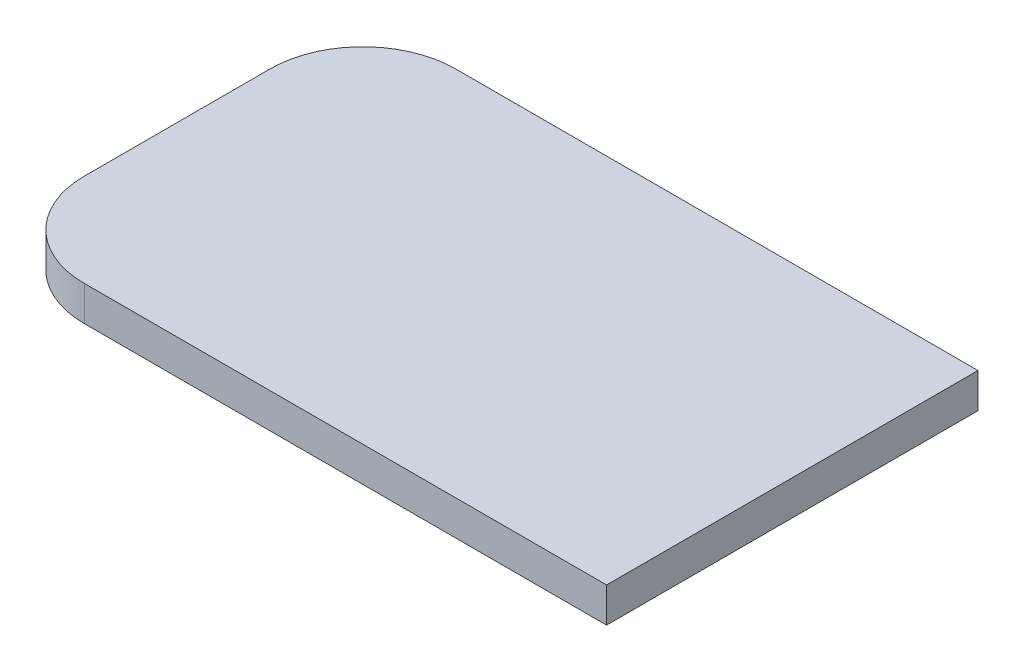
ISO-10303-21;
HEADER;
FILE_DESCRIPTION(('STEP AP214'),'2;1');
FILE_NAME('part.step','',(''),(''),'','','');
FILE_SCHEMA(('AUTOMOTIVE_DESIGN { 1 0 10303 214 1 1 1 1 }'));
ENDSEC;
DATA;
#1=APPLICATION_CONTEXT('core data for automotive mechanical design processes');
#2=APPLICATION_PROTOCOL_DEFINITION('international standard','automotive_design',2000,#1);
#3=PRODUCT_CONTEXT('',#1,'mechanical');
#4=PRODUCT('Part','Part','',(#3));
#5=PRODUCT_RELATED_PRODUCT_CATEGORY('part','',(#4));
#6=PRODUCT_DEFINITION_FORMATION('','',#4);
#7=PRODUCT_DEFINITION_CONTEXT('part definition',#1,'design');
#8=PRODUCT_DEFINITION('design','',#6,#7);
#9=PRODUCT_DEFINITION_SHAPE('','',#8);
#10=(LENGTH_UNIT() NAMED_UNIT(*) SI_UNIT(.MILLI.,.METRE.));
#11=(NAMED_UNIT(*) PLANE_ANGLE_UNIT() SI_UNIT($,.RADIAN.));
#12=(NAMED_UNIT(*) SI_UNIT($,.STERADIAN.) SOLID_ANGLE_UNIT());
#13=UNCERTAINTY_MEASURE_WITH_UNIT(LENGTH_MEASURE(1.E-05),#10,'distance_accuracy_value','');
#14=(GEOMETRIC_REPRESENTATION_CONTEXT(3) GLOBAL_UNCERTAINTY_ASSIGNED_CONTEXT((#13)) GLOBAL_UNIT_ASSIGNED_CONTEXT((#10,
#11,#12)) REPRESENTATION_CONTEXT('',''));
#15=CARTESIAN_POINT('',(0.,0.,0.));
#16=DIRECTION('',(0.,0.,1.));
#17=DIRECTION('',(1.,0.,0.));
#18=AXIS2_PLACEMENT_3D('',#15,#16,#17);
#19=CARTESIAN_POINT('',(-5.,8.,-8.));
#20=DIRECTION('',(0.,0.,1.));
#21=DIRECTION('',(1.,0.,0.));
#22=AXIS2_PLACEMENT_3D('',#19,#20,#21);
#23=PLANE('',#22);
#24=DIRECTION('',(1.,0.,0.));
#25=VECTOR('',#24,1.);
#26=CARTESIAN_POINT('',(-68.5,-5.,-8.));
#27=LINE('',#26,#25);
#28=CARTESIAN_POINT('',(-91.,-5.,-7.99999999999998));
#29=VERTEX_POINT('',#28);
#30=CARTESIAN_POINT('',(-68.5,-5.,-8.));
#31=VERTEX_POINT('',#30);
#32=EDGE_CURVE('E84',#29,#31,#27,.T.);
#33=ORIENTED_EDGE('',*,*,#32,.T.);
#34=DIRECTION('',(0.,1.,0.));
#35=VECTOR('',#34,1.);
#36=CARTESIAN_POINT('',(-68.5,-6.5,-8.));
#37=LINE('',#36,#35);
#38=CARTESIAN_POINT('',(-68.5,-6.5,-8.));
#39=VERTEX_POINT('',#38);
#40=EDGE_CURVE('E88',#39,#31,#37,.T.);
#41=ORIENTED_EDGE('',*,*,#40,.F.);
#42=DIRECTION('',(1.,0.,0.));
#43=VECTOR('',#42,1.);
#44=CARTESIAN_POINT('',(-68.5,-6.5,-8.));
#45=LINE('',#44,#43);
#46=CARTESIAN_POINT('',(-91.,-6.5,-7.99999999999998));
#47=VERTEX_POINT('',#46);
#48=EDGE_CURVE('E134',#47,#39,#45,.T.);
#49=ORIENTED_EDGE('',*,*,#48,.F.);
#50=DIRECTION('',(0.,-1.,0.));
#51=VECTOR('',#50,1.);
#52=CARTESIAN_POINT('',(-91.,5.5,-7.99999999999998));
#53=LINE('',#52,#51);
#54=EDGE_CURVE('E11',#29,#47,#53,.T.);
#55=ORIENTED_EDGE('',*,*,#54,.F.);
#56=EDGE_LOOP('',(#33,#41,#49,#55));
#57=FACE_BOUND('',#56,.T.);
#58=ADVANCED_FACE('F36',(#57),#23,.F.);
#59=CARTESIAN_POINT('',(-5.,8.,8.));
#60=DIRECTION('',(0.,0.,-1.));
#61=DIRECTION('',(-1.,0.,0.));
#62=AXIS2_PLACEMENT_3D('',#59,#60,#61);
#63=PLANE('',#62);
#64=DIRECTION('',(-1.,0.,0.));
#65=VECTOR('',#64,1.);
#66=CARTESIAN_POINT('',(-91.,-5.,8.));
#67=LINE('',#66,#65);
#68=CARTESIAN_POINT('',(-68.5,-5.,8.));
#69=VERTEX_POINT('',#68);
#70=CARTESIAN_POINT('',(-91.,-5.,8.));
#71=VERTEX_POINT('',#70);
#72=EDGE_CURVE('E92',#69,#71,#67,.T.);
#73=ORIENTED_EDGE('',*,*,#72,.T.);
#74=DIRECTION('',(0.,-1.,0.));
#75=VECTOR('',#74,1.);
#76=CARTESIAN_POINT('',(-91.,5.5,8.00000000000001));
#77=LINE('',#76,#75);
#78=CARTESIAN_POINT('',(-91.,-6.5,8.));
#79=VERTEX_POINT('',#78);
#80=EDGE_CURVE('E52',#71,#79,#77,.T.);
#81=ORIENTED_EDGE('',*,*,#80,.T.);
#82=DIRECTION('',(-1.,0.,0.));
#83=VECTOR('',#82,1.);
#84=CARTESIAN_POINT('',(-91.,-6.5,8.));
#85=LINE('',#84,#83);
#86=CARTESIAN_POINT('',(-68.5,-6.5,8.));
#87=VERTEX_POINT('',#86);
#88=EDGE_CURVE('E108',#87,#79,#85,.T.);
#89=ORIENTED_EDGE('',*,*,#88,.F.);
#90=DIRECTION('',(0.,1.,0.));
#91=VECTOR('',#90,1.);
#92=CARTESIAN_POINT('',(-68.5,-6.5,8.));
#93=LINE('',#92,#91);
#94=EDGE_CURVE('E106',#87,#69,#93,.T.);
#95=ORIENTED_EDGE('',*,*,#94,.T.);
#96=EDGE_LOOP('',(#73,#81,#89,#95));
#97=FACE_BOUND('',#96,.T.);
#98=ADVANCED_FACE('F38',(#97),#63,.F.);
#99=CARTESIAN_POINT('',(-91.,5.5,-3.99999999999998));
#100=DIRECTION('',(0.,-1.,0.));
#101=DIRECTION('',(0.,0.,-1.));
#102=AXIS2_PLACEMENT_3D('',#99,#100,#101);
#103=CYLINDRICAL_SURFACE('',#102,4.);
#104=CARTESIAN_POINT('',(-91.,-5.,-3.99999999999998));
#105=DIRECTION('',(0.,1.,0.));
#106=DIRECTION('',(0.,0.,1.));
#107=AXIS2_PLACEMENT_3D('',#104,#105,#106);
#108=CIRCLE('',#107,4.);
#109=CARTESIAN_POINT('',(-95.,-5.,-3.99999999999998));
#110=VERTEX_POINT('',#109);
#111=EDGE_CURVE('E93',#29,#110,#108,.T.);
#112=ORIENTED_EDGE('',*,*,#111,.F.);
#113=ORIENTED_EDGE('',*,*,#54,.T.);
#114=CARTESIAN_POINT('',(-91.,-6.5,-3.99999999999998));
#115=DIRECTION('',(0.,-1.,0.));
#116=DIRECTION('',(0.,0.,-1.));
#117=AXIS2_PLACEMENT_3D('',#114,#115,#116);
#118=CIRCLE('',#117,4.);
#119=CARTESIAN_POINT('',(-95.,-6.5,-3.99999999999998));
#120=VERTEX_POINT('',#119);
#121=EDGE_CURVE('E129',#120,#47,#118,.T.);
#122=ORIENTED_EDGE('',*,*,#121,.F.);
#123=DIRECTION('',(0.,-1.,0.));
#124=VECTOR('',#123,1.);
#125=CARTESIAN_POINT('',(-95.,5.5,-3.99999999999998));
#126=LINE('',#125,#124);
#127=EDGE_CURVE('E45',#110,#120,#126,.T.);
#128=ORIENTED_EDGE('',*,*,#127,.F.);
#129=EDGE_LOOP('',(#112,#113,#122,#128));
#130=FACE_BOUND('',#129,.T.);
#131=ADVANCED_FACE('F133',(#130),#103,.T.);
#132=CARTESIAN_POINT('',(-95.,5.5,-3.99999999999998));
#133=DIRECTION('',(1.,0.,0.));
#134=DIRECTION('',(0.,0.,-1.));
#135=AXIS2_PLACEMENT_3D('',#132,#133,#134);
#136=PLANE('',#135);
#137=DIRECTION('',(0.,0.,1.));
#138=VECTOR('',#137,1.);
#139=CARTESIAN_POINT('',(-95.,-5.,-3.99999999999998));
#140=LINE('',#139,#138);
#141=CARTESIAN_POINT('',(-95.,-5.,4.));
#142=VERTEX_POINT('',#141);
#143=EDGE_CURVE('E123',#110,#142,#140,.T.);
#144=ORIENTED_EDGE('',*,*,#143,.F.);
#145=ORIENTED_EDGE('',*,*,#127,.T.);
#146=DIRECTION('',(0.,0.,-1.));
#147=VECTOR('',#146,1.);
#148=CARTESIAN_POINT('',(-95.,-6.5,4.));
#149=LINE('',#148,#147);
#150=CARTESIAN_POINT('',(-95.,-6.5,4.));
#151=VERTEX_POINT('',#150);
#152=EDGE_CURVE('E121',#151,#120,#149,.T.);
#153=ORIENTED_EDGE('',*,*,#152,.F.);
#154=DIRECTION('',(0.,-1.,0.));
#155=VECTOR('',#154,1.);
#156=CARTESIAN_POINT('',(-95.,5.5,4.));
#157=LINE('',#156,#155);
#158=EDGE_CURVE('E113',#142,#151,#157,.T.);
#159=ORIENTED_EDGE('',*,*,#158,.F.);
#160=EDGE_LOOP('',(#144,#145,#153,#159));
#161=FACE_BOUND('',#160,.T.);
#162=ADVANCED_FACE('F119',(#161),#136,.F.);
#163=CARTESIAN_POINT('',(-91.,5.5,4.));
#164=DIRECTION('',(0.,-1.,0.));
#165=DIRECTION('',(0.,0.,-1.));
#166=AXIS2_PLACEMENT_3D('',#163,#164,#165);
#167=CYLINDRICAL_SURFACE('',#166,4.00000000000001);
#168=CARTESIAN_POINT('',(-91.,-5.,4.));
#169=DIRECTION('',(0.,1.,0.));
#170=DIRECTION('',(0.,0.,1.));
#171=AXIS2_PLACEMENT_3D('',#168,#169,#170);
#172=CIRCLE('',#171,4.00000000000001);
#173=EDGE_CURVE('E143',#142,#71,#172,.T.);
#174=ORIENTED_EDGE('',*,*,#173,.F.);
#175=ORIENTED_EDGE('',*,*,#158,.T.);
#176=CARTESIAN_POINT('',(-91.,-6.5,4.));
#177=DIRECTION('',(0.,-1.,0.));
#178=DIRECTION('',(0.,0.,-1.));
#179=AXIS2_PLACEMENT_3D('',#176,#177,#178);
#180=CIRCLE('',#179,4.);
#181=EDGE_CURVE('E131',#79,#151,#180,.T.);
#182=ORIENTED_EDGE('',*,*,#181,.F.);
#183=ORIENTED_EDGE('',*,*,#80,.F.);
#184=EDGE_LOOP('',(#174,#175,#182,#183));
#185=FACE_BOUND('',#184,.T.);
#186=ADVANCED_FACE('F146',(#185),#167,.T.);
#187=CARTESIAN_POINT('',(-91.,-5.,4.));
#188=DIRECTION('',(0.,-1.,0.));
#189=DIRECTION('',(0.,0.,-1.));
#190=AXIS2_PLACEMENT_3D('',#187,#188,#189);
#191=PLANE('',#190);
#192=ORIENTED_EDGE('',*,*,#32,.F.);
#193=ORIENTED_EDGE('',*,*,#111,.T.);
#194=ORIENTED_EDGE('',*,*,#143,.T.);
#195=ORIENTED_EDGE('',*,*,#173,.T.);
#196=ORIENTED_EDGE('',*,*,#72,.F.);
#197=DIRECTION('',(0.,0.,1.));
#198=VECTOR('',#197,1.);
#199=CARTESIAN_POINT('',(-68.5,-5.,0.));
#200=LINE('',#199,#198);
#201=EDGE_CURVE('E97',#31,#69,#200,.T.);
#202=ORIENTED_EDGE('',*,*,#201,.F.);
#203=EDGE_LOOP('',(#192,#193,#194,#195,#196,#202));
#204=FACE_BOUND('',#203,.T.);
#205=ADVANCED_FACE('F98',(#204),#191,.F.);
#206=CARTESIAN_POINT('',(-68.5,-6.5,8.));
#207=DIRECTION('',(-1.,0.,0.));
#208=DIRECTION('',(0.,0.,1.));
#209=AXIS2_PLACEMENT_3D('',#206,#207,#208);
#210=PLANE('',#209);
#211=ORIENTED_EDGE('',*,*,#201,.T.);
#212=ORIENTED_EDGE('',*,*,#94,.F.);
#213=DIRECTION('',(0.,0.,1.));
#214=VECTOR('',#213,1.);
#215=CARTESIAN_POINT('',(-68.5,-6.5,8.));
#216=LINE('',#215,#214);
#217=EDGE_CURVE('E105',#39,#87,#216,.T.);
#218=ORIENTED_EDGE('',*,*,#217,.F.);
#219=ORIENTED_EDGE('',*,*,#40,.T.);
#220=EDGE_LOOP('',(#211,#212,#218,#219));
#221=FACE_BOUND('',#220,.T.);
#222=ADVANCED_FACE('F104',(#221),#210,.F.);
#223=CARTESIAN_POINT('',(-91.,-6.5,4.));
#224=DIRECTION('',(0.,-1.,0.));
#225=DIRECTION('',(0.,0.,-1.));
#226=AXIS2_PLACEMENT_3D('',#223,#224,#225);
#227=PLANE('',#226);
#228=ORIENTED_EDGE('',*,*,#181,.T.);
#229=ORIENTED_EDGE('',*,*,#152,.T.);
#230=ORIENTED_EDGE('',*,*,#121,.T.);
#231=ORIENTED_EDGE('',*,*,#48,.T.);
#232=ORIENTED_EDGE('',*,*,#217,.T.);
#233=ORIENTED_EDGE('',*,*,#88,.T.);
#234=EDGE_LOOP('',(#228,#229,#230,#231,#232,#233));
#235=FACE_BOUND('',#234,.T.);
#236=ADVANCED_FACE('F128',(#235),#227,.T.);
#237=CLOSED_SHELL('',(#58,#98,#131,#162,#186,#205,#222,#236));
#238=MANIFOLD_SOLID_BREP('B2',#237);
#239=ADVANCED_BREP_SHAPE_REPRESENTATION('',(#18,#238),#14);
#240=SHAPE_DEFINITION_REPRESENTATION(#9,#239);
ENDSEC;
END-ISO-10303-21;
